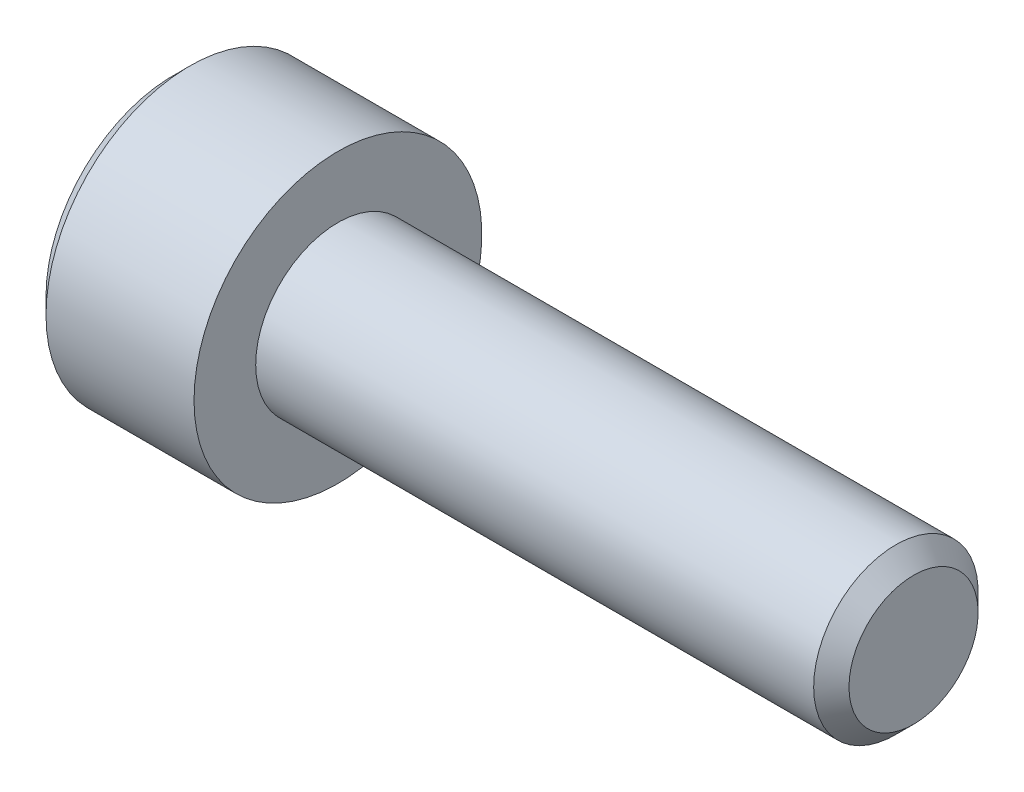
ISO-10303-21;
HEADER;
FILE_DESCRIPTION(('STEP AP214'),'2;1');
FILE_NAME('part.step','',(''),(''),'','','');
FILE_SCHEMA(('AUTOMOTIVE_DESIGN { 1 0 10303 214 1 1 1 1 }'));
ENDSEC;
DATA;
#1=APPLICATION_CONTEXT('core data for automotive mechanical design processes');
#2=APPLICATION_PROTOCOL_DEFINITION('international standard','automotive_design',2000,#1);
#3=PRODUCT_CONTEXT('',#1,'mechanical');
#4=PRODUCT('Part','Part','',(#3));
#5=PRODUCT_RELATED_PRODUCT_CATEGORY('part','',(#4));
#6=PRODUCT_DEFINITION_FORMATION('','',#4);
#7=PRODUCT_DEFINITION_CONTEXT('part definition',#1,'design');
#8=PRODUCT_DEFINITION('design','',#6,#7);
#9=PRODUCT_DEFINITION_SHAPE('','',#8);
#10=(LENGTH_UNIT() NAMED_UNIT(*) SI_UNIT(.MILLI.,.METRE.));
#11=(NAMED_UNIT(*) PLANE_ANGLE_UNIT() SI_UNIT($,.RADIAN.));
#12=(NAMED_UNIT(*) SI_UNIT($,.STERADIAN.) SOLID_ANGLE_UNIT());
#13=UNCERTAINTY_MEASURE_WITH_UNIT(LENGTH_MEASURE(1.E-05),#10,'distance_accuracy_value','');
#14=(GEOMETRIC_REPRESENTATION_CONTEXT(3) GLOBAL_UNCERTAINTY_ASSIGNED_CONTEXT((#13)) GLOBAL_UNIT_ASSIGNED_CONTEXT((#10,
#11,#12)) REPRESENTATION_CONTEXT('',''));
#15=CARTESIAN_POINT('',(0.,0.,0.));
#16=DIRECTION('',(0.,0.,1.));
#17=DIRECTION('',(1.,0.,0.));
#18=AXIS2_PLACEMENT_3D('',#15,#16,#17);
#19=CARTESIAN_POINT('',(-4.,-3.10000000000001,0.));
#20=DIRECTION('',(-1.,0.,0.));
#21=DIRECTION('',(0.,0.,1.));
#22=AXIS2_PLACEMENT_3D('',#19,#20,#21);
#23=PLANE('',#22);
#24=DIRECTION('',(0.,0.5,-0.866025403784439));
#25=VECTOR('',#24,1.);
#26=CARTESIAN_POINT('',(-4.,0.866025403784439,1.5));
#27=LINE('',#26,#25);
#28=CARTESIAN_POINT('',(-4.,0.866025403784439,1.5));
#29=VERTEX_POINT('',#28);
#30=CARTESIAN_POINT('',(-4.,1.73205080756888,0.));
#31=VERTEX_POINT('',#30);
#32=EDGE_CURVE('E59',#29,#31,#27,.T.);
#33=ORIENTED_EDGE('',*,*,#32,.F.);
#34=DIRECTION('',(0.,1.,0.));
#35=VECTOR('',#34,1.);
#36=CARTESIAN_POINT('',(-4.,-0.86602540378444,1.5));
#37=LINE('',#36,#35);
#38=CARTESIAN_POINT('',(-4.,-0.86602540378444,1.5));
#39=VERTEX_POINT('',#38);
#40=EDGE_CURVE('E142',#39,#29,#37,.T.);
#41=ORIENTED_EDGE('',*,*,#40,.F.);
#42=DIRECTION('',(0.,0.5,0.866025403784439));
#43=VECTOR('',#42,1.);
#44=CARTESIAN_POINT('',(-4.,-1.73205080756888,0.));
#45=LINE('',#44,#43);
#46=CARTESIAN_POINT('',(-4.,-1.73205080756888,0.));
#47=VERTEX_POINT('',#46);
#48=EDGE_CURVE('E140',#47,#39,#45,.T.);
#49=ORIENTED_EDGE('',*,*,#48,.F.);
#50=DIRECTION('',(0.,-0.5,0.866025403784439));
#51=VECTOR('',#50,1.);
#52=CARTESIAN_POINT('',(-4.,-0.866025403784439,-1.5));
#53=LINE('',#52,#51);
#54=CARTESIAN_POINT('',(-4.,-0.866025403784439,-1.5));
#55=VERTEX_POINT('',#54);
#56=EDGE_CURVE('E107',#55,#47,#53,.T.);
#57=ORIENTED_EDGE('',*,*,#56,.F.);
#58=DIRECTION('',(0.,-1.,0.));
#59=VECTOR('',#58,1.);
#60=CARTESIAN_POINT('',(-4.,0.866025403784439,-1.5));
#61=LINE('',#60,#59);
#62=CARTESIAN_POINT('',(-4.,0.866025403784439,-1.5));
#63=VERTEX_POINT('',#62);
#64=EDGE_CURVE('E136',#63,#55,#61,.T.);
#65=ORIENTED_EDGE('',*,*,#64,.F.);
#66=DIRECTION('',(0.,-0.5,-0.866025403784439));
#67=VECTOR('',#66,1.);
#68=CARTESIAN_POINT('',(-4.,1.73205080756888,0.));
#69=LINE('',#68,#67);
#70=EDGE_CURVE('E133',#31,#63,#69,.T.);
#71=ORIENTED_EDGE('',*,*,#70,.F.);
#72=EDGE_LOOP('',(#33,#41,#49,#57,#65,#71));
#73=FACE_BOUND('',#72,.T.);
#74=CARTESIAN_POINT('',(-4.,0.,0.));
#75=DIRECTION('',(-1.,0.,0.));
#76=DIRECTION('',(0.,0.,1.));
#77=AXIS2_PLACEMENT_3D('',#74,#75,#76);
#78=CIRCLE('',#77,3.10000000000001);
#79=CARTESIAN_POINT('',(-4.,0.,3.10000000000001));
#80=VERTEX_POINT('',#79);
#81=EDGE_CURVE('E146',#80,#80,#78,.T.);
#82=ORIENTED_EDGE('',*,*,#81,.T.);
#83=EDGE_LOOP('',(#82));
#84=FACE_BOUND('',#83,.T.);
#85=ADVANCED_FACE('F45',(#73,#84),#23,.T.);
#86=CARTESIAN_POINT('',(14.,0.,0.));
#87=DIRECTION('',(1.,0.,0.));
#88=DIRECTION('',(0.,0.,-1.));
#89=AXIS2_PLACEMENT_3D('',#86,#87,#88);
#90=PLANE('',#89);
#91=CARTESIAN_POINT('',(14.,0.,0.));
#92=DIRECTION('',(-1.,0.,0.));
#93=DIRECTION('',(0.,0.,1.));
#94=AXIS2_PLACEMENT_3D('',#91,#92,#93);
#95=CIRCLE('',#94,1.5705);
#96=CARTESIAN_POINT('',(14.,0.,1.5705));
#97=VERTEX_POINT('',#96);
#98=EDGE_CURVE('E11',#97,#97,#95,.T.);
#99=ORIENTED_EDGE('',*,*,#98,.F.);
#100=EDGE_LOOP('',(#99));
#101=FACE_BOUND('',#100,.T.);
#102=ADVANCED_FACE('F170',(#101),#90,.T.);
#103=CARTESIAN_POINT('',(13.5705,0.,0.));
#104=DIRECTION('',(-1.,0.,0.));
#105=DIRECTION('',(0.,0.,1.));
#106=AXIS2_PLACEMENT_3D('',#103,#104,#105);
#107=CONICAL_SURFACE('',#106,2.,0.785398163397457);
#108=ORIENTED_EDGE('',*,*,#98,.T.);
#109=EDGE_LOOP('',(#108));
#110=FACE_BOUND('',#109,.T.);
#111=CARTESIAN_POINT('',(13.5705,0.,0.));
#112=DIRECTION('',(-1.,0.,0.));
#113=DIRECTION('',(0.,0.,1.));
#114=AXIS2_PLACEMENT_3D('',#111,#112,#113);
#115=CIRCLE('',#114,2.);
#116=CARTESIAN_POINT('',(13.5705,0.,2.));
#117=VERTEX_POINT('',#116);
#118=EDGE_CURVE('E52',#117,#117,#115,.T.);
#119=ORIENTED_EDGE('',*,*,#118,.F.);
#120=EDGE_LOOP('',(#119));
#121=FACE_BOUND('',#120,.T.);
#122=ADVANCED_FACE('F168',(#110,#121),#107,.T.);
#123=CARTESIAN_POINT('',(-4.9,0.,0.));
#124=DIRECTION('',(-1.,0.,0.));
#125=DIRECTION('',(0.,0.,1.));
#126=AXIS2_PLACEMENT_3D('',#123,#124,#125);
#127=CYLINDRICAL_SURFACE('',#126,2.);
#128=ORIENTED_EDGE('',*,*,#118,.T.);
#129=EDGE_LOOP('',(#128));
#130=FACE_BOUND('',#129,.T.);
#131=CARTESIAN_POINT('',(0.,0.,0.));
#132=DIRECTION('',(-1.,0.,0.));
#133=DIRECTION('',(0.,0.,1.));
#134=AXIS2_PLACEMENT_3D('',#131,#132,#133);
#135=CIRCLE('',#134,2.);
#136=CARTESIAN_POINT('',(0.,0.,2.));
#137=VERTEX_POINT('',#136);
#138=EDGE_CURVE('E160',#137,#137,#135,.T.);
#139=ORIENTED_EDGE('',*,*,#138,.F.);
#140=EDGE_LOOP('',(#139));
#141=FACE_BOUND('',#140,.T.);
#142=ADVANCED_FACE('F165',(#130,#141),#127,.T.);
#143=CARTESIAN_POINT('',(0.,-2.,0.));
#144=DIRECTION('',(1.,0.,0.));
#145=DIRECTION('',(0.,0.,-1.));
#146=AXIS2_PLACEMENT_3D('',#143,#144,#145);
#147=PLANE('',#146);
#148=ORIENTED_EDGE('',*,*,#138,.T.);
#149=EDGE_LOOP('',(#148));
#150=FACE_BOUND('',#149,.T.);
#151=CARTESIAN_POINT('',(0.,0.,0.));
#152=DIRECTION('',(-1.,0.,0.));
#153=DIRECTION('',(0.,0.,1.));
#154=AXIS2_PLACEMENT_3D('',#151,#152,#153);
#155=CIRCLE('',#154,3.5);
#156=CARTESIAN_POINT('',(0.,0.,3.5));
#157=VERTEX_POINT('',#156);
#158=EDGE_CURVE('E157',#157,#157,#155,.T.);
#159=ORIENTED_EDGE('',*,*,#158,.F.);
#160=EDGE_LOOP('',(#159));
#161=FACE_BOUND('',#160,.T.);
#162=ADVANCED_FACE('F178',(#150,#161),#147,.T.);
#163=CARTESIAN_POINT('',(-4.9,0.,0.));
#164=DIRECTION('',(-1.,0.,0.));
#165=DIRECTION('',(0.,0.,1.));
#166=AXIS2_PLACEMENT_3D('',#163,#164,#165);
#167=CYLINDRICAL_SURFACE('',#166,3.5);
#168=ORIENTED_EDGE('',*,*,#158,.T.);
#169=EDGE_LOOP('',(#168));
#170=FACE_BOUND('',#169,.T.);
#171=CARTESIAN_POINT('',(-3.6,0.,0.));
#172=DIRECTION('',(-1.,0.,0.));
#173=DIRECTION('',(0.,0.,1.));
#174=AXIS2_PLACEMENT_3D('',#171,#172,#173);
#175=CIRCLE('',#174,3.5);
#176=CARTESIAN_POINT('',(-3.6,0.,3.5));
#177=VERTEX_POINT('',#176);
#178=EDGE_CURVE('E154',#177,#177,#175,.T.);
#179=ORIENTED_EDGE('',*,*,#178,.F.);
#180=EDGE_LOOP('',(#179));
#181=FACE_BOUND('',#180,.T.);
#182=ADVANCED_FACE('F194',(#170,#181),#167,.T.);
#183=CARTESIAN_POINT('',(-4.,0.,0.));
#184=DIRECTION('',(1.,0.,0.));
#185=DIRECTION('',(0.,0.,-1.));
#186=AXIS2_PLACEMENT_3D('',#183,#184,#185);
#187=CONICAL_SURFACE('',#186,3.10000000000001,0.785398163397443);
#188=ORIENTED_EDGE('',*,*,#178,.T.);
#189=EDGE_LOOP('',(#188));
#190=FACE_BOUND('',#189,.T.);
#191=ORIENTED_EDGE('',*,*,#81,.F.);
#192=EDGE_LOOP('',(#191));
#193=FACE_BOUND('',#192,.T.);
#194=ADVANCED_FACE('F192',(#190,#193),#187,.T.);
#195=CARTESIAN_POINT('',(-2.,0.866025403784439,1.5));
#196=DIRECTION('',(0.,0.866025403784439,0.5));
#197=DIRECTION('',(0.,-0.5,0.866025403784439));
#198=AXIS2_PLACEMENT_3D('',#195,#196,#197);
#199=PLANE('',#198);
#200=ORIENTED_EDGE('',*,*,#32,.T.);
#201=DIRECTION('',(-1.,0.,0.));
#202=VECTOR('',#201,1.);
#203=CARTESIAN_POINT('',(-2.,1.73205080756888,0.));
#204=LINE('',#203,#202);
#205=CARTESIAN_POINT('',(-2.,1.73205080756888,0.));
#206=VERTEX_POINT('',#205);
#207=EDGE_CURVE('E89',#206,#31,#204,.T.);
#208=ORIENTED_EDGE('',*,*,#207,.F.);
#209=DIRECTION('',(0.,0.5,-0.866025403784439));
#210=VECTOR('',#209,1.);
#211=CARTESIAN_POINT('',(-2.,0.866025403784439,1.5));
#212=LINE('',#211,#210);
#213=CARTESIAN_POINT('',(-2.,0.866025403784439,1.5));
#214=VERTEX_POINT('',#213);
#215=EDGE_CURVE('E144',#214,#206,#212,.T.);
#216=ORIENTED_EDGE('',*,*,#215,.F.);
#217=DIRECTION('',(-1.,0.,0.));
#218=VECTOR('',#217,1.);
#219=CARTESIAN_POINT('',(-2.,0.866025403784439,1.5));
#220=LINE('',#219,#218);
#221=EDGE_CURVE('E67',#214,#29,#220,.T.);
#222=ORIENTED_EDGE('',*,*,#221,.T.);
#223=EDGE_LOOP('',(#200,#208,#216,#222));
#224=FACE_BOUND('',#223,.T.);
#225=ADVANCED_FACE('F193',(#224),#199,.F.);
#226=CARTESIAN_POINT('',(-2.,-0.86602540378444,1.5));
#227=DIRECTION('',(0.,0.,1.));
#228=DIRECTION('',(0.,-1.,0.));
#229=AXIS2_PLACEMENT_3D('',#226,#227,#228);
#230=PLANE('',#229);
#231=ORIENTED_EDGE('',*,*,#40,.T.);
#232=ORIENTED_EDGE('',*,*,#221,.F.);
#233=DIRECTION('',(0.,1.,0.));
#234=VECTOR('',#233,1.);
#235=CARTESIAN_POINT('',(-2.,-0.86602540378444,1.5));
#236=LINE('',#235,#234);
#237=CARTESIAN_POINT('',(-2.,-0.86602540378444,1.5));
#238=VERTEX_POINT('',#237);
#239=EDGE_CURVE('E119',#238,#214,#236,.T.);
#240=ORIENTED_EDGE('',*,*,#239,.F.);
#241=DIRECTION('',(-1.,0.,0.));
#242=VECTOR('',#241,1.);
#243=CARTESIAN_POINT('',(-2.,-0.86602540378444,1.5));
#244=LINE('',#243,#242);
#245=EDGE_CURVE('E111',#238,#39,#244,.T.);
#246=ORIENTED_EDGE('',*,*,#245,.T.);
#247=EDGE_LOOP('',(#231,#232,#240,#246));
#248=FACE_BOUND('',#247,.T.);
#249=ADVANCED_FACE('F200',(#248),#230,.F.);
#250=CARTESIAN_POINT('',(-2.,-1.73205080756888,0.));
#251=DIRECTION('',(0.,-0.866025403784439,0.5));
#252=DIRECTION('',(0.,-0.5,-0.866025403784439));
#253=AXIS2_PLACEMENT_3D('',#250,#251,#252);
#254=PLANE('',#253);
#255=ORIENTED_EDGE('',*,*,#48,.T.);
#256=ORIENTED_EDGE('',*,*,#245,.F.);
#257=DIRECTION('',(0.,0.5,0.866025403784439));
#258=VECTOR('',#257,1.);
#259=CARTESIAN_POINT('',(-2.,-1.73205080756888,0.));
#260=LINE('',#259,#258);
#261=CARTESIAN_POINT('',(-2.,-1.73205080756888,0.));
#262=VERTEX_POINT('',#261);
#263=EDGE_CURVE('E115',#262,#238,#260,.T.);
#264=ORIENTED_EDGE('',*,*,#263,.F.);
#265=DIRECTION('',(-1.,0.,0.));
#266=VECTOR('',#265,1.);
#267=CARTESIAN_POINT('',(-2.,-1.73205080756888,0.));
#268=LINE('',#267,#266);
#269=EDGE_CURVE('E100',#262,#47,#268,.T.);
#270=ORIENTED_EDGE('',*,*,#269,.T.);
#271=EDGE_LOOP('',(#255,#256,#264,#270));
#272=FACE_BOUND('',#271,.T.);
#273=ADVANCED_FACE('F116',(#272),#254,.F.);
#274=CARTESIAN_POINT('',(-2.,-0.866025403784439,-1.5));
#275=DIRECTION('',(0.,-0.866025403784439,-0.5));
#276=DIRECTION('',(0.,0.5,-0.866025403784439));
#277=AXIS2_PLACEMENT_3D('',#274,#275,#276);
#278=PLANE('',#277);
#279=ORIENTED_EDGE('',*,*,#56,.T.);
#280=ORIENTED_EDGE('',*,*,#269,.F.);
#281=DIRECTION('',(0.,-0.5,0.866025403784439));
#282=VECTOR('',#281,1.);
#283=CARTESIAN_POINT('',(-2.,-0.866025403784439,-1.5));
#284=LINE('',#283,#282);
#285=CARTESIAN_POINT('',(-2.,-0.866025403784439,-1.5));
#286=VERTEX_POINT('',#285);
#287=EDGE_CURVE('E104',#286,#262,#284,.T.);
#288=ORIENTED_EDGE('',*,*,#287,.F.);
#289=DIRECTION('',(-1.,0.,0.));
#290=VECTOR('',#289,1.);
#291=CARTESIAN_POINT('',(-2.,-0.866025403784439,-1.5));
#292=LINE('',#291,#290);
#293=EDGE_CURVE('E112',#286,#55,#292,.T.);
#294=ORIENTED_EDGE('',*,*,#293,.T.);
#295=EDGE_LOOP('',(#279,#280,#288,#294));
#296=FACE_BOUND('',#295,.T.);
#297=ADVANCED_FACE('F102',(#296),#278,.F.);
#298=CARTESIAN_POINT('',(-2.,0.866025403784439,-1.5));
#299=DIRECTION('',(0.,0.,-1.));
#300=DIRECTION('',(-1.,0.,0.));
#301=AXIS2_PLACEMENT_3D('',#298,#299,#300);
#302=PLANE('',#301);
#303=ORIENTED_EDGE('',*,*,#64,.T.);
#304=ORIENTED_EDGE('',*,*,#293,.F.);
#305=DIRECTION('',(0.,-1.,0.));
#306=VECTOR('',#305,1.);
#307=CARTESIAN_POINT('',(-2.,0.866025403784439,-1.5));
#308=LINE('',#307,#306);
#309=CARTESIAN_POINT('',(-2.,0.866025403784439,-1.5));
#310=VERTEX_POINT('',#309);
#311=EDGE_CURVE('E125',#310,#286,#308,.T.);
#312=ORIENTED_EDGE('',*,*,#311,.F.);
#313=DIRECTION('',(-1.,0.,0.));
#314=VECTOR('',#313,1.);
#315=CARTESIAN_POINT('',(-2.,0.866025403784439,-1.5));
#316=LINE('',#315,#314);
#317=EDGE_CURVE('E149',#310,#63,#316,.T.);
#318=ORIENTED_EDGE('',*,*,#317,.T.);
#319=EDGE_LOOP('',(#303,#304,#312,#318));
#320=FACE_BOUND('',#319,.T.);
#321=ADVANCED_FACE('F259',(#320),#302,.F.);
#322=CARTESIAN_POINT('',(-2.,1.73205080756888,0.));
#323=DIRECTION('',(0.,0.866025403784439,-0.5));
#324=DIRECTION('',(0.,0.5,0.866025403784439));
#325=AXIS2_PLACEMENT_3D('',#322,#323,#324);
#326=PLANE('',#325);
#327=ORIENTED_EDGE('',*,*,#70,.T.);
#328=ORIENTED_EDGE('',*,*,#317,.F.);
#329=DIRECTION('',(0.,-0.5,-0.866025403784439));
#330=VECTOR('',#329,1.);
#331=CARTESIAN_POINT('',(-2.,1.73205080756888,0.));
#332=LINE('',#331,#330);
#333=EDGE_CURVE('E127',#206,#310,#332,.T.);
#334=ORIENTED_EDGE('',*,*,#333,.F.);
#335=ORIENTED_EDGE('',*,*,#207,.T.);
#336=EDGE_LOOP('',(#327,#328,#334,#335));
#337=FACE_BOUND('',#336,.T.);
#338=ADVANCED_FACE('F268',(#337),#326,.F.);
#339=CARTESIAN_POINT('',(-2.,0.,0.));
#340=DIRECTION('',(-1.,0.,0.));
#341=DIRECTION('',(0.,0.,1.));
#342=AXIS2_PLACEMENT_3D('',#339,#340,#341);
#343=PLANE('',#342);
#344=ORIENTED_EDGE('',*,*,#215,.T.);
#345=ORIENTED_EDGE('',*,*,#333,.T.);
#346=ORIENTED_EDGE('',*,*,#311,.T.);
#347=ORIENTED_EDGE('',*,*,#287,.T.);
#348=ORIENTED_EDGE('',*,*,#263,.T.);
#349=ORIENTED_EDGE('',*,*,#239,.T.);
#350=EDGE_LOOP('',(#344,#345,#346,#347,#348,#349));
#351=FACE_BOUND('',#350,.T.);
#352=ADVANCED_FACE('F122',(#351),#343,.T.);
#353=CLOSED_SHELL('',(#85,#102,#122,#142,#162,#182,#194,#225,#249,#273,#297,#321,#338,#352));
#354=MANIFOLD_SOLID_BREP('B2',#353);
#355=ADVANCED_BREP_SHAPE_REPRESENTATION('',(#18,#354),#14);
#356=SHAPE_DEFINITION_REPRESENTATION(#9,#355);
ENDSEC;
END-ISO-10303-21;
